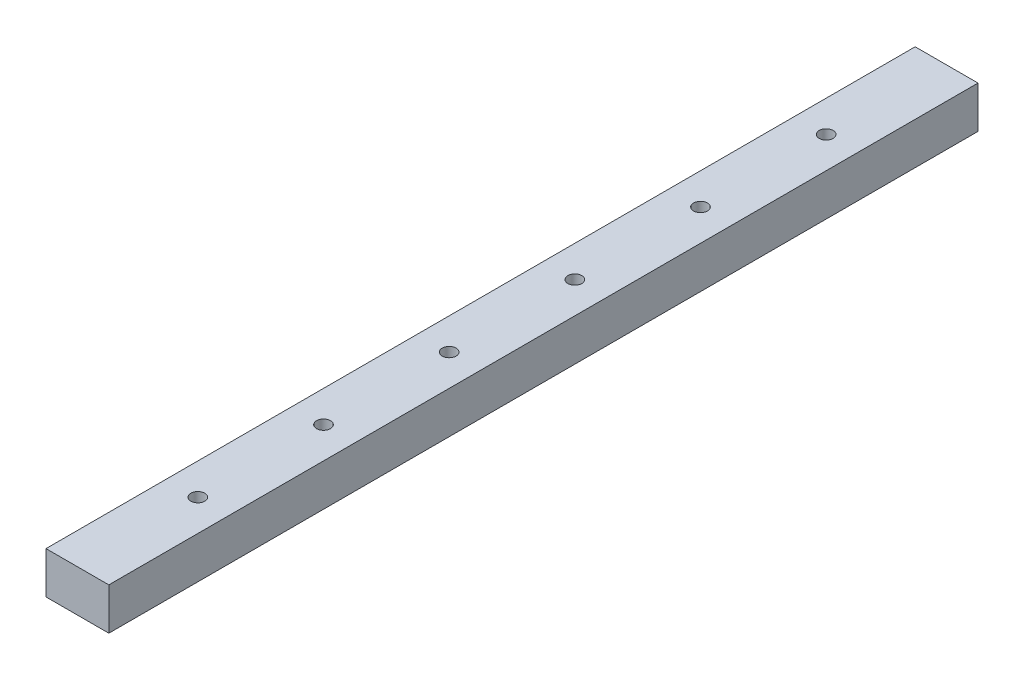
ISO-10303-21;
HEADER;
FILE_DESCRIPTION(('STEP AP214'),'2;1');
FILE_NAME('part.step','',(''),(''),'','','');
FILE_SCHEMA(('AUTOMOTIVE_DESIGN { 1 0 10303 214 1 1 1 1 }'));
ENDSEC;
DATA;
#1=APPLICATION_CONTEXT('core data for automotive mechanical design processes');
#2=APPLICATION_PROTOCOL_DEFINITION('international standard','automotive_design',2000,#1);
#3=PRODUCT_CONTEXT('',#1,'mechanical');
#4=PRODUCT('Part','Part','',(#3));
#5=PRODUCT_RELATED_PRODUCT_CATEGORY('part','',(#4));
#6=PRODUCT_DEFINITION_FORMATION('','',#4);
#7=PRODUCT_DEFINITION_CONTEXT('part definition',#1,'design');
#8=PRODUCT_DEFINITION('design','',#6,#7);
#9=PRODUCT_DEFINITION_SHAPE('','',#8);
#10=(LENGTH_UNIT() NAMED_UNIT(*) SI_UNIT(.MILLI.,.METRE.));
#11=(NAMED_UNIT(*) PLANE_ANGLE_UNIT() SI_UNIT($,.RADIAN.));
#12=(NAMED_UNIT(*) SI_UNIT($,.STERADIAN.) SOLID_ANGLE_UNIT());
#13=UNCERTAINTY_MEASURE_WITH_UNIT(LENGTH_MEASURE(1.E-05),#10,'distance_accuracy_value','');
#14=(GEOMETRIC_REPRESENTATION_CONTEXT(3) GLOBAL_UNCERTAINTY_ASSIGNED_CONTEXT((#13)) GLOBAL_UNIT_ASSIGNED_CONTEXT((#10,
#11,#12)) REPRESENTATION_CONTEXT('',''));
#15=CARTESIAN_POINT('',(0.,0.,0.));
#16=DIRECTION('',(0.,0.,1.));
#17=DIRECTION('',(1.,0.,0.));
#18=AXIS2_PLACEMENT_3D('',#15,#16,#17);
#19=CARTESIAN_POINT('',(15.875,0.,527.05));
#20=DIRECTION('',(1.,0.,0.));
#21=DIRECTION('',(0.,1.,0.));
#22=AXIS2_PLACEMENT_3D('',#19,#20,#21);
#23=PLANE('',#22);
#24=DIRECTION('',(0.,-1.,0.));
#25=VECTOR('',#24,1.);
#26=CARTESIAN_POINT('',(15.875,0.,0.));
#27=LINE('',#26,#25);
#28=CARTESIAN_POINT('',(15.875,12.7,0.));
#29=VERTEX_POINT('',#28);
#30=CARTESIAN_POINT('',(15.875,-12.7,0.));
#31=VERTEX_POINT('',#30);
#32=EDGE_CURVE('E109',#29,#31,#27,.T.);
#33=ORIENTED_EDGE('',*,*,#32,.F.);
#34=DIRECTION('',(0.,0.,-1.));
#35=VECTOR('',#34,1.);
#36=CARTESIAN_POINT('',(15.875,12.7,527.05));
#37=LINE('',#36,#35);
#38=CARTESIAN_POINT('',(15.875,12.7,527.05));
#39=VERTEX_POINT('',#38);
#40=EDGE_CURVE('E11',#39,#29,#37,.T.);
#41=ORIENTED_EDGE('',*,*,#40,.F.);
#42=DIRECTION('',(0.,-1.,0.));
#43=VECTOR('',#42,1.);
#44=CARTESIAN_POINT('',(15.875,0.,527.05));
#45=LINE('',#44,#43);
#46=CARTESIAN_POINT('',(15.875,-12.7,527.05));
#47=VERTEX_POINT('',#46);
#48=EDGE_CURVE('E90',#39,#47,#45,.T.);
#49=ORIENTED_EDGE('',*,*,#48,.T.);
#50=DIRECTION('',(0.,0.,-1.));
#51=VECTOR('',#50,1.);
#52=CARTESIAN_POINT('',(15.875,-12.7,527.05));
#53=LINE('',#52,#51);
#54=EDGE_CURVE('E58',#47,#31,#53,.T.);
#55=ORIENTED_EDGE('',*,*,#54,.T.);
#56=EDGE_LOOP('',(#33,#41,#49,#55));
#57=FACE_BOUND('',#56,.T.);
#58=ADVANCED_FACE('F41',(#57),#23,.T.);
#59=CARTESIAN_POINT('',(0.,12.7,527.05));
#60=DIRECTION('',(0.,-1.,0.));
#61=DIRECTION('',(1.,0.,0.));
#62=AXIS2_PLACEMENT_3D('',#59,#60,#61);
#63=PLANE('',#62);
#64=CARTESIAN_POINT('',(-3.17499999999999,12.7,454.025));
#65=DIRECTION('',(0.,-1.,0.));
#66=DIRECTION('',(0.,0.,-1.));
#67=AXIS2_PLACEMENT_3D('',#64,#65,#66);
#68=CIRCLE('',#67,4.21639999999999);
#69=CARTESIAN_POINT('',(-3.17499999999999,12.7,449.8086));
#70=VERTEX_POINT('',#69);
#71=EDGE_CURVE('E187',#70,#70,#68,.T.);
#72=ORIENTED_EDGE('',*,*,#71,.T.);
#73=EDGE_LOOP('',(#72));
#74=FACE_BOUND('',#73,.T.);
#75=CARTESIAN_POINT('',(-3.17499999999973,12.7,377.825));
#76=DIRECTION('',(0.,-1.,0.));
#77=DIRECTION('',(0.,0.,-1.));
#78=AXIS2_PLACEMENT_3D('',#75,#76,#77);
#79=CIRCLE('',#78,4.21639999999999);
#80=CARTESIAN_POINT('',(-3.17499999999973,12.7,373.6086));
#81=VERTEX_POINT('',#80);
#82=EDGE_CURVE('E175',#81,#81,#79,.T.);
#83=ORIENTED_EDGE('',*,*,#82,.T.);
#84=EDGE_LOOP('',(#83));
#85=FACE_BOUND('',#84,.T.);
#86=CARTESIAN_POINT('',(-3.17499999999946,12.7,301.625));
#87=DIRECTION('',(0.,-1.,0.));
#88=DIRECTION('',(0.,0.,-1.));
#89=AXIS2_PLACEMENT_3D('',#86,#87,#88);
#90=CIRCLE('',#89,4.21639999999999);
#91=CARTESIAN_POINT('',(-3.17499999999946,12.7,297.4086));
#92=VERTEX_POINT('',#91);
#93=EDGE_CURVE('E163',#92,#92,#90,.T.);
#94=ORIENTED_EDGE('',*,*,#93,.T.);
#95=EDGE_LOOP('',(#94));
#96=FACE_BOUND('',#95,.T.);
#97=CARTESIAN_POINT('',(-3.1749999999992,12.7,225.425));
#98=DIRECTION('',(0.,-1.,0.));
#99=DIRECTION('',(0.,0.,-1.));
#100=AXIS2_PLACEMENT_3D('',#97,#98,#99);
#101=CIRCLE('',#100,4.21639999999999);
#102=CARTESIAN_POINT('',(-3.1749999999992,12.7,221.2086));
#103=VERTEX_POINT('',#102);
#104=EDGE_CURVE('E151',#103,#103,#101,.T.);
#105=ORIENTED_EDGE('',*,*,#104,.T.);
#106=EDGE_LOOP('',(#105));
#107=FACE_BOUND('',#106,.T.);
#108=CARTESIAN_POINT('',(-3.17499999999893,12.7,149.225));
#109=DIRECTION('',(0.,-1.,0.));
#110=DIRECTION('',(0.,0.,-1.));
#111=AXIS2_PLACEMENT_3D('',#108,#109,#110);
#112=CIRCLE('',#111,4.21639999999999);
#113=CARTESIAN_POINT('',(-3.17499999999893,12.7,145.0086));
#114=VERTEX_POINT('',#113);
#115=EDGE_CURVE('E139',#114,#114,#112,.T.);
#116=ORIENTED_EDGE('',*,*,#115,.T.);
#117=EDGE_LOOP('',(#116));
#118=FACE_BOUND('',#117,.T.);
#119=CARTESIAN_POINT('',(-3.17499999999866,12.7,73.025));
#120=DIRECTION('',(0.,-1.,0.));
#121=DIRECTION('',(0.,0.,-1.));
#122=AXIS2_PLACEMENT_3D('',#119,#120,#121);
#123=CIRCLE('',#122,4.21639999999999);
#124=CARTESIAN_POINT('',(-3.17499999999866,12.7,68.8086));
#125=VERTEX_POINT('',#124);
#126=EDGE_CURVE('E112',#125,#125,#123,.T.);
#127=ORIENTED_EDGE('',*,*,#126,.T.);
#128=EDGE_LOOP('',(#127));
#129=FACE_BOUND('',#128,.T.);
#130=DIRECTION('',(-1.,0.,0.));
#131=VECTOR('',#130,1.);
#132=CARTESIAN_POINT('',(0.,12.7,0.));
#133=LINE('',#132,#131);
#134=CARTESIAN_POINT('',(-22.225,12.7,0.));
#135=VERTEX_POINT('',#134);
#136=EDGE_CURVE('E97',#29,#135,#133,.T.);
#137=ORIENTED_EDGE('',*,*,#136,.T.);
#138=DIRECTION('',(0.,0.,-1.));
#139=VECTOR('',#138,1.);
#140=CARTESIAN_POINT('',(-22.225,12.7,527.05));
#141=LINE('',#140,#139);
#142=CARTESIAN_POINT('',(-22.225,12.7,527.05));
#143=VERTEX_POINT('',#142);
#144=EDGE_CURVE('E50',#143,#135,#141,.T.);
#145=ORIENTED_EDGE('',*,*,#144,.F.);
#146=DIRECTION('',(-1.,0.,0.));
#147=VECTOR('',#146,1.);
#148=CARTESIAN_POINT('',(0.,12.7,527.05));
#149=LINE('',#148,#147);
#150=EDGE_CURVE('E84',#39,#143,#149,.T.);
#151=ORIENTED_EDGE('',*,*,#150,.F.);
#152=ORIENTED_EDGE('',*,*,#40,.T.);
#153=EDGE_LOOP('',(#137,#145,#151,#152));
#154=FACE_BOUND('',#153,.T.);
#155=ADVANCED_FACE('F95',(#74,#85,#96,#107,#118,#129,#154),#63,.F.);
#156=CARTESIAN_POINT('',(-22.225,0.,527.05));
#157=DIRECTION('',(-1.,0.,0.));
#158=DIRECTION('',(0.,0.,1.));
#159=AXIS2_PLACEMENT_3D('',#156,#157,#158);
#160=PLANE('',#159);
#161=DIRECTION('',(0.,1.,0.));
#162=VECTOR('',#161,1.);
#163=CARTESIAN_POINT('',(-22.225,0.,0.));
#164=LINE('',#163,#162);
#165=CARTESIAN_POINT('',(-22.225,-12.7,0.));
#166=VERTEX_POINT('',#165);
#167=EDGE_CURVE('E115',#166,#135,#164,.T.);
#168=ORIENTED_EDGE('',*,*,#167,.F.);
#169=DIRECTION('',(0.,0.,-1.));
#170=VECTOR('',#169,1.);
#171=CARTESIAN_POINT('',(-22.225,-12.7,527.05));
#172=LINE('',#171,#170);
#173=CARTESIAN_POINT('',(-22.225,-12.7,527.05));
#174=VERTEX_POINT('',#173);
#175=EDGE_CURVE('E71',#174,#166,#172,.T.);
#176=ORIENTED_EDGE('',*,*,#175,.F.);
#177=DIRECTION('',(0.,1.,0.));
#178=VECTOR('',#177,1.);
#179=CARTESIAN_POINT('',(-22.225,0.,527.05));
#180=LINE('',#179,#178);
#181=EDGE_CURVE('E89',#174,#143,#180,.T.);
#182=ORIENTED_EDGE('',*,*,#181,.T.);
#183=ORIENTED_EDGE('',*,*,#144,.T.);
#184=EDGE_LOOP('',(#168,#176,#182,#183));
#185=FACE_BOUND('',#184,.T.);
#186=ADVANCED_FACE('F101',(#185),#160,.T.);
#187=CARTESIAN_POINT('',(0.,-12.7,527.05));
#188=DIRECTION('',(0.,-1.,0.));
#189=DIRECTION('',(1.,0.,0.));
#190=AXIS2_PLACEMENT_3D('',#187,#188,#189);
#191=PLANE('',#190);
#192=CARTESIAN_POINT('',(-3.17499999999999,-12.7,454.025));
#193=DIRECTION('',(0.,-1.,0.));
#194=DIRECTION('',(0.,0.,-1.));
#195=AXIS2_PLACEMENT_3D('',#192,#193,#194);
#196=CIRCLE('',#195,8.0645);
#197=CARTESIAN_POINT('',(-3.17499999999999,-12.7,445.9605));
#198=VERTEX_POINT('',#197);
#199=EDGE_CURVE('E195',#198,#198,#196,.T.);
#200=ORIENTED_EDGE('',*,*,#199,.F.);
#201=EDGE_LOOP('',(#200));
#202=FACE_BOUND('',#201,.T.);
#203=CARTESIAN_POINT('',(-3.17499999999973,-12.7,377.825));
#204=DIRECTION('',(0.,-1.,0.));
#205=DIRECTION('',(0.,0.,-1.));
#206=AXIS2_PLACEMENT_3D('',#203,#204,#205);
#207=CIRCLE('',#206,8.0645);
#208=CARTESIAN_POINT('',(-3.17499999999973,-12.7,369.7605));
#209=VERTEX_POINT('',#208);
#210=EDGE_CURVE('E183',#209,#209,#207,.T.);
#211=ORIENTED_EDGE('',*,*,#210,.F.);
#212=EDGE_LOOP('',(#211));
#213=FACE_BOUND('',#212,.T.);
#214=CARTESIAN_POINT('',(-3.17499999999946,-12.7,301.625));
#215=DIRECTION('',(0.,-1.,0.));
#216=DIRECTION('',(0.,0.,-1.));
#217=AXIS2_PLACEMENT_3D('',#214,#215,#216);
#218=CIRCLE('',#217,8.0645);
#219=CARTESIAN_POINT('',(-3.17499999999946,-12.7,293.5605));
#220=VERTEX_POINT('',#219);
#221=EDGE_CURVE('E171',#220,#220,#218,.T.);
#222=ORIENTED_EDGE('',*,*,#221,.F.);
#223=EDGE_LOOP('',(#222));
#224=FACE_BOUND('',#223,.T.);
#225=CARTESIAN_POINT('',(-3.1749999999992,-12.7,225.425));
#226=DIRECTION('',(0.,-1.,0.));
#227=DIRECTION('',(0.,0.,-1.));
#228=AXIS2_PLACEMENT_3D('',#225,#226,#227);
#229=CIRCLE('',#228,8.0645);
#230=CARTESIAN_POINT('',(-3.1749999999992,-12.7,217.3605));
#231=VERTEX_POINT('',#230);
#232=EDGE_CURVE('E159',#231,#231,#229,.T.);
#233=ORIENTED_EDGE('',*,*,#232,.F.);
#234=EDGE_LOOP('',(#233));
#235=FACE_BOUND('',#234,.T.);
#236=CARTESIAN_POINT('',(-3.17499999999893,-12.7,149.225));
#237=DIRECTION('',(0.,-1.,0.));
#238=DIRECTION('',(0.,0.,-1.));
#239=AXIS2_PLACEMENT_3D('',#236,#237,#238);
#240=CIRCLE('',#239,8.0645);
#241=CARTESIAN_POINT('',(-3.17499999999893,-12.7,141.1605));
#242=VERTEX_POINT('',#241);
#243=EDGE_CURVE('E147',#242,#242,#240,.T.);
#244=ORIENTED_EDGE('',*,*,#243,.F.);
#245=EDGE_LOOP('',(#244));
#246=FACE_BOUND('',#245,.T.);
#247=CARTESIAN_POINT('',(-3.17499999999866,-12.7,73.025));
#248=DIRECTION('',(0.,-1.,0.));
#249=DIRECTION('',(0.,0.,-1.));
#250=AXIS2_PLACEMENT_3D('',#247,#248,#249);
#251=CIRCLE('',#250,8.0645);
#252=CARTESIAN_POINT('',(-3.17499999999866,-12.7,64.9605));
#253=VERTEX_POINT('',#252);
#254=EDGE_CURVE('E135',#253,#253,#251,.T.);
#255=ORIENTED_EDGE('',*,*,#254,.F.);
#256=EDGE_LOOP('',(#255));
#257=FACE_BOUND('',#256,.T.);
#258=DIRECTION('',(-1.,0.,0.));
#259=VECTOR('',#258,1.);
#260=CARTESIAN_POINT('',(0.,-12.7,0.));
#261=LINE('',#260,#259);
#262=EDGE_CURVE('E118',#31,#166,#261,.T.);
#263=ORIENTED_EDGE('',*,*,#262,.F.);
#264=ORIENTED_EDGE('',*,*,#54,.F.);
#265=DIRECTION('',(-1.,0.,0.));
#266=VECTOR('',#265,1.);
#267=CARTESIAN_POINT('',(0.,-12.7,527.05));
#268=LINE('',#267,#266);
#269=EDGE_CURVE('E103',#47,#174,#268,.T.);
#270=ORIENTED_EDGE('',*,*,#269,.T.);
#271=ORIENTED_EDGE('',*,*,#175,.T.);
#272=EDGE_LOOP('',(#263,#264,#270,#271));
#273=FACE_BOUND('',#272,.T.);
#274=ADVANCED_FACE('F202',(#202,#213,#224,#235,#246,#257,#273),#191,.T.);
#275=CARTESIAN_POINT('',(0.,0.,527.05));
#276=DIRECTION('',(0.,0.,1.));
#277=DIRECTION('',(1.,0.,0.));
#278=AXIS2_PLACEMENT_3D('',#275,#276,#277);
#279=PLANE('',#278);
#280=ORIENTED_EDGE('',*,*,#48,.F.);
#281=ORIENTED_EDGE('',*,*,#150,.T.);
#282=ORIENTED_EDGE('',*,*,#181,.F.);
#283=ORIENTED_EDGE('',*,*,#269,.F.);
#284=EDGE_LOOP('',(#280,#281,#282,#283));
#285=FACE_BOUND('',#284,.T.);
#286=ADVANCED_FACE('F86',(#285),#279,.T.);
#287=CARTESIAN_POINT('',(0.,0.,0.));
#288=DIRECTION('',(0.,0.,1.));
#289=DIRECTION('',(1.,0.,0.));
#290=AXIS2_PLACEMENT_3D('',#287,#288,#289);
#291=PLANE('',#290);
#292=ORIENTED_EDGE('',*,*,#32,.T.);
#293=ORIENTED_EDGE('',*,*,#262,.T.);
#294=ORIENTED_EDGE('',*,*,#167,.T.);
#295=ORIENTED_EDGE('',*,*,#136,.F.);
#296=EDGE_LOOP('',(#292,#293,#294,#295));
#297=FACE_BOUND('',#296,.T.);
#298=ADVANCED_FACE('F229',(#297),#291,.F.);
#299=CARTESIAN_POINT('',(-3.17499999999866,-12.7,73.025));
#300=DIRECTION('',(0.,-1.,0.));
#301=DIRECTION('',(0.,0.,-1.));
#302=AXIS2_PLACEMENT_3D('',#299,#300,#301);
#303=CYLINDRICAL_SURFACE('',#302,4.21639999999999);
#304=ORIENTED_EDGE('',*,*,#126,.F.);
#305=EDGE_LOOP('',(#304));
#306=FACE_BOUND('',#305,.T.);
#307=CARTESIAN_POINT('',(-3.17499999999866,-8.27326733217284,73.025));
#308=DIRECTION('',(0.,-1.,0.));
#309=DIRECTION('',(0.,0.,-1.));
#310=AXIS2_PLACEMENT_3D('',#307,#308,#309);
#311=CIRCLE('',#310,4.21639999999999);
#312=CARTESIAN_POINT('',(-3.17499999999866,-8.27326733217284,68.8086));
#313=VERTEX_POINT('',#312);
#314=EDGE_CURVE('E131',#313,#313,#311,.T.);
#315=ORIENTED_EDGE('',*,*,#314,.T.);
#316=EDGE_LOOP('',(#315));
#317=FACE_BOUND('',#316,.T.);
#318=ADVANCED_FACE('F219',(#306,#317),#303,.F.);
#319=CARTESIAN_POINT('',(-3.17499999999866,-12.7,73.025));
#320=DIRECTION('',(0.,-1.,0.));
#321=DIRECTION('',(0.,0.,-1.));
#322=AXIS2_PLACEMENT_3D('',#319,#320,#321);
#323=CONICAL_SURFACE('',#322,8.0645,0.715584993317676);
#324=ORIENTED_EDGE('',*,*,#314,.F.);
#325=EDGE_LOOP('',(#324));
#326=FACE_BOUND('',#325,.T.);
#327=ORIENTED_EDGE('',*,*,#254,.T.);
#328=EDGE_LOOP('',(#327));
#329=FACE_BOUND('',#328,.T.);
#330=ADVANCED_FACE('F216',(#326,#329),#323,.F.);
#331=CARTESIAN_POINT('',(-3.17499999999893,-12.7,149.225));
#332=DIRECTION('',(0.,-1.,0.));
#333=DIRECTION('',(0.,0.,-1.));
#334=AXIS2_PLACEMENT_3D('',#331,#332,#333);
#335=CYLINDRICAL_SURFACE('',#334,4.21639999999999);
#336=ORIENTED_EDGE('',*,*,#115,.F.);
#337=EDGE_LOOP('',(#336));
#338=FACE_BOUND('',#337,.T.);
#339=CARTESIAN_POINT('',(-3.17499999999893,-8.27326733217284,149.225));
#340=DIRECTION('',(0.,-1.,0.));
#341=DIRECTION('',(0.,0.,-1.));
#342=AXIS2_PLACEMENT_3D('',#339,#340,#341);
#343=CIRCLE('',#342,4.21639999999999);
#344=CARTESIAN_POINT('',(-3.17499999999893,-8.27326733217284,145.0086));
#345=VERTEX_POINT('',#344);
#346=EDGE_CURVE('E143',#345,#345,#343,.T.);
#347=ORIENTED_EDGE('',*,*,#346,.T.);
#348=EDGE_LOOP('',(#347));
#349=FACE_BOUND('',#348,.T.);
#350=ADVANCED_FACE('F218',(#338,#349),#335,.F.);
#351=CARTESIAN_POINT('',(-3.17499999999893,-12.7,149.225));
#352=DIRECTION('',(0.,-1.,0.));
#353=DIRECTION('',(0.,0.,-1.));
#354=AXIS2_PLACEMENT_3D('',#351,#352,#353);
#355=CONICAL_SURFACE('',#354,8.0645,0.715584993317676);
#356=ORIENTED_EDGE('',*,*,#346,.F.);
#357=EDGE_LOOP('',(#356));
#358=FACE_BOUND('',#357,.T.);
#359=ORIENTED_EDGE('',*,*,#243,.T.);
#360=EDGE_LOOP('',(#359));
#361=FACE_BOUND('',#360,.T.);
#362=ADVANCED_FACE('F226',(#358,#361),#355,.F.);
#363=CARTESIAN_POINT('',(-3.1749999999992,-12.7,225.425));
#364=DIRECTION('',(0.,-1.,0.));
#365=DIRECTION('',(0.,0.,-1.));
#366=AXIS2_PLACEMENT_3D('',#363,#364,#365);
#367=CYLINDRICAL_SURFACE('',#366,4.21639999999999);
#368=ORIENTED_EDGE('',*,*,#104,.F.);
#369=EDGE_LOOP('',(#368));
#370=FACE_BOUND('',#369,.T.);
#371=CARTESIAN_POINT('',(-3.1749999999992,-8.27326733217284,225.425));
#372=DIRECTION('',(0.,-1.,0.));
#373=DIRECTION('',(0.,0.,-1.));
#374=AXIS2_PLACEMENT_3D('',#371,#372,#373);
#375=CIRCLE('',#374,4.21639999999999);
#376=CARTESIAN_POINT('',(-3.1749999999992,-8.27326733217284,221.2086));
#377=VERTEX_POINT('',#376);
#378=EDGE_CURVE('E155',#377,#377,#375,.T.);
#379=ORIENTED_EDGE('',*,*,#378,.T.);
#380=EDGE_LOOP('',(#379));
#381=FACE_BOUND('',#380,.T.);
#382=ADVANCED_FACE('F298',(#370,#381),#367,.F.);
#383=CARTESIAN_POINT('',(-3.1749999999992,-12.7,225.425));
#384=DIRECTION('',(0.,-1.,0.));
#385=DIRECTION('',(0.,0.,-1.));
#386=AXIS2_PLACEMENT_3D('',#383,#384,#385);
#387=CONICAL_SURFACE('',#386,8.0645,0.715584993317676);
#388=ORIENTED_EDGE('',*,*,#378,.F.);
#389=EDGE_LOOP('',(#388));
#390=FACE_BOUND('',#389,.T.);
#391=ORIENTED_EDGE('',*,*,#232,.T.);
#392=EDGE_LOOP('',(#391));
#393=FACE_BOUND('',#392,.T.);
#394=ADVANCED_FACE('F307',(#390,#393),#387,.F.);
#395=CARTESIAN_POINT('',(-3.17499999999946,-12.7,301.625));
#396=DIRECTION('',(0.,-1.,0.));
#397=DIRECTION('',(0.,0.,-1.));
#398=AXIS2_PLACEMENT_3D('',#395,#396,#397);
#399=CYLINDRICAL_SURFACE('',#398,4.21639999999999);
#400=ORIENTED_EDGE('',*,*,#93,.F.);
#401=EDGE_LOOP('',(#400));
#402=FACE_BOUND('',#401,.T.);
#403=CARTESIAN_POINT('',(-3.17499999999946,-8.27326733217284,301.625));
#404=DIRECTION('',(0.,-1.,0.));
#405=DIRECTION('',(0.,0.,-1.));
#406=AXIS2_PLACEMENT_3D('',#403,#404,#405);
#407=CIRCLE('',#406,4.21639999999999);
#408=CARTESIAN_POINT('',(-3.17499999999946,-8.27326733217284,297.4086));
#409=VERTEX_POINT('',#408);
#410=EDGE_CURVE('E167',#409,#409,#407,.T.);
#411=ORIENTED_EDGE('',*,*,#410,.T.);
#412=EDGE_LOOP('',(#411));
#413=FACE_BOUND('',#412,.T.);
#414=ADVANCED_FACE('F316',(#402,#413),#399,.F.);
#415=CARTESIAN_POINT('',(-3.17499999999946,-12.7,301.625));
#416=DIRECTION('',(0.,-1.,0.));
#417=DIRECTION('',(0.,0.,-1.));
#418=AXIS2_PLACEMENT_3D('',#415,#416,#417);
#419=CONICAL_SURFACE('',#418,8.0645,0.715584993317676);
#420=ORIENTED_EDGE('',*,*,#410,.F.);
#421=EDGE_LOOP('',(#420));
#422=FACE_BOUND('',#421,.T.);
#423=ORIENTED_EDGE('',*,*,#221,.T.);
#424=EDGE_LOOP('',(#423));
#425=FACE_BOUND('',#424,.T.);
#426=ADVANCED_FACE('F325',(#422,#425),#419,.F.);
#427=CARTESIAN_POINT('',(-3.17499999999973,-12.7,377.825));
#428=DIRECTION('',(0.,-1.,0.));
#429=DIRECTION('',(0.,0.,-1.));
#430=AXIS2_PLACEMENT_3D('',#427,#428,#429);
#431=CYLINDRICAL_SURFACE('',#430,4.21639999999999);
#432=ORIENTED_EDGE('',*,*,#82,.F.);
#433=EDGE_LOOP('',(#432));
#434=FACE_BOUND('',#433,.T.);
#435=CARTESIAN_POINT('',(-3.17499999999973,-8.27326733217284,377.825));
#436=DIRECTION('',(0.,-1.,0.));
#437=DIRECTION('',(0.,0.,-1.));
#438=AXIS2_PLACEMENT_3D('',#435,#436,#437);
#439=CIRCLE('',#438,4.21639999999999);
#440=CARTESIAN_POINT('',(-3.17499999999973,-8.27326733217284,373.6086));
#441=VERTEX_POINT('',#440);
#442=EDGE_CURVE('E179',#441,#441,#439,.T.);
#443=ORIENTED_EDGE('',*,*,#442,.T.);
#444=EDGE_LOOP('',(#443));
#445=FACE_BOUND('',#444,.T.);
#446=ADVANCED_FACE('F334',(#434,#445),#431,.F.);
#447=CARTESIAN_POINT('',(-3.17499999999973,-12.7,377.825));
#448=DIRECTION('',(0.,-1.,0.));
#449=DIRECTION('',(0.,0.,-1.));
#450=AXIS2_PLACEMENT_3D('',#447,#448,#449);
#451=CONICAL_SURFACE('',#450,8.0645,0.715584993317676);
#452=ORIENTED_EDGE('',*,*,#442,.F.);
#453=EDGE_LOOP('',(#452));
#454=FACE_BOUND('',#453,.T.);
#455=ORIENTED_EDGE('',*,*,#210,.T.);
#456=EDGE_LOOP('',(#455));
#457=FACE_BOUND('',#456,.T.);
#458=ADVANCED_FACE('F343',(#454,#457),#451,.F.);
#459=CARTESIAN_POINT('',(-3.17499999999999,-12.7,454.025));
#460=DIRECTION('',(0.,-1.,0.));
#461=DIRECTION('',(0.,0.,-1.));
#462=AXIS2_PLACEMENT_3D('',#459,#460,#461);
#463=CYLINDRICAL_SURFACE('',#462,4.21639999999999);
#464=ORIENTED_EDGE('',*,*,#71,.F.);
#465=EDGE_LOOP('',(#464));
#466=FACE_BOUND('',#465,.T.);
#467=CARTESIAN_POINT('',(-3.17499999999999,-8.27326733217284,454.025));
#468=DIRECTION('',(0.,-1.,0.));
#469=DIRECTION('',(0.,0.,-1.));
#470=AXIS2_PLACEMENT_3D('',#467,#468,#469);
#471=CIRCLE('',#470,4.21639999999999);
#472=CARTESIAN_POINT('',(-3.17499999999999,-8.27326733217284,449.8086));
#473=VERTEX_POINT('',#472);
#474=EDGE_CURVE('E191',#473,#473,#471,.T.);
#475=ORIENTED_EDGE('',*,*,#474,.T.);
#476=EDGE_LOOP('',(#475));
#477=FACE_BOUND('',#476,.T.);
#478=ADVANCED_FACE('F352',(#466,#477),#463,.F.);
#479=CARTESIAN_POINT('',(-3.17499999999999,-12.7,454.025));
#480=DIRECTION('',(0.,-1.,0.));
#481=DIRECTION('',(0.,0.,-1.));
#482=AXIS2_PLACEMENT_3D('',#479,#480,#481);
#483=CONICAL_SURFACE('',#482,8.0645,0.715584993317676);
#484=ORIENTED_EDGE('',*,*,#474,.F.);
#485=EDGE_LOOP('',(#484));
#486=FACE_BOUND('',#485,.T.);
#487=ORIENTED_EDGE('',*,*,#199,.T.);
#488=EDGE_LOOP('',(#487));
#489=FACE_BOUND('',#488,.T.);
#490=ADVANCED_FACE('F200',(#486,#489),#483,.F.);
#491=CLOSED_SHELL('',(#58,#155,#186,#274,#286,#298,#318,#330,#350,#362,#382,#394,#414,#426,#446,
#458,#478,#490));
#492=MANIFOLD_SOLID_BREP('B2',#491);
#493=ADVANCED_BREP_SHAPE_REPRESENTATION('',(#18,#492),#14);
#494=SHAPE_DEFINITION_REPRESENTATION(#9,#493);
ENDSEC;
END-ISO-10303-21;
